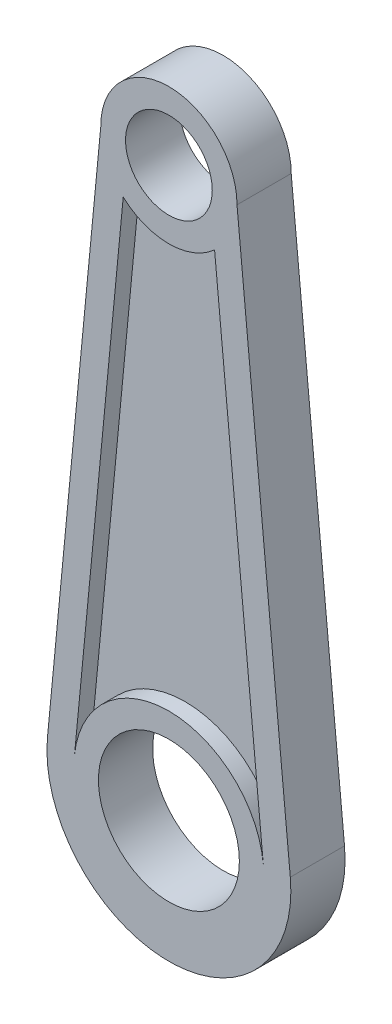
ISO-10303-21;
HEADER;
FILE_DESCRIPTION(('STEP AP214'),'2;1');
FILE_NAME('part.step','',(''),(''),'','','');
FILE_SCHEMA(('AUTOMOTIVE_DESIGN { 1 0 10303 214 1 1 1 1 }'));
ENDSEC;
DATA;
#1=APPLICATION_CONTEXT('core data for automotive mechanical design processes');
#2=APPLICATION_PROTOCOL_DEFINITION('international standard','automotive_design',2000,#1);
#3=PRODUCT_CONTEXT('',#1,'mechanical');
#4=PRODUCT('Part','Part','',(#3));
#5=PRODUCT_RELATED_PRODUCT_CATEGORY('part','',(#4));
#6=PRODUCT_DEFINITION_FORMATION('','',#4);
#7=PRODUCT_DEFINITION_CONTEXT('part definition',#1,'design');
#8=PRODUCT_DEFINITION('design','',#6,#7);
#9=PRODUCT_DEFINITION_SHAPE('','',#8);
#10=(LENGTH_UNIT() NAMED_UNIT(*) SI_UNIT(.MILLI.,.METRE.));
#11=(NAMED_UNIT(*) PLANE_ANGLE_UNIT() SI_UNIT($,.RADIAN.));
#12=(NAMED_UNIT(*) SI_UNIT($,.STERADIAN.) SOLID_ANGLE_UNIT());
#13=UNCERTAINTY_MEASURE_WITH_UNIT(LENGTH_MEASURE(1.E-05),#10,'distance_accuracy_value','');
#14=(GEOMETRIC_REPRESENTATION_CONTEXT(3) GLOBAL_UNCERTAINTY_ASSIGNED_CONTEXT((#13)) GLOBAL_UNIT_ASSIGNED_CONTEXT((#10,
#11,#12)) REPRESENTATION_CONTEXT('',''));
#15=CARTESIAN_POINT('',(0.,0.,0.));
#16=DIRECTION('',(0.,0.,1.));
#17=DIRECTION('',(1.,0.,0.));
#18=AXIS2_PLACEMENT_3D('',#15,#16,#17);
#19=CARTESIAN_POINT('',(-12.4428586323303,105.897439266632,10.));
#20=DIRECTION('',(0.995428690586424,-0.0955077062723116,0.));
#21=DIRECTION('',(0.0955077062723116,0.995428690586424,0.));
#22=AXIS2_PLACEMENT_3D('',#19,#20,#21);
#23=PLANE('',#22);
#24=DIRECTION('',(0.,0.,-1.));
#25=VECTOR('',#24,1.);
#26=CARTESIAN_POINT('',(-12.5624393828669,104.651109367486,10.));
#27=LINE('',#26,#25);
#28=CARTESIAN_POINT('',(-12.5624393828669,104.651109367486,0.));
#29=VERTEX_POINT('',#28);
#30=CARTESIAN_POINT('',(-12.5624393828669,104.651109367486,10.));
#31=VERTEX_POINT('',#30);
#32=EDGE_CURVE('E182',#29,#31,#27,.F.);
#33=ORIENTED_EDGE('',*,*,#32,.F.);
#34=DIRECTION('',(-0.0955077062723116,-0.995428690586424,0.));
#35=VECTOR('',#34,1.);
#36=CARTESIAN_POINT('',(-12.4428586323303,105.897439266632,0.));
#37=LINE('',#36,#35);
#38=CARTESIAN_POINT('',(-22.3971455381945,2.14892339112701,0.));
#39=VERTEX_POINT('',#38);
#40=EDGE_CURVE('E227',#29,#39,#37,.T.);
#41=ORIENTED_EDGE('',*,*,#40,.T.);
#42=DIRECTION('',(0.,0.,-1.));
#43=VECTOR('',#42,1.);
#44=CARTESIAN_POINT('',(-22.3971455381945,2.14892339112701,10.));
#45=LINE('',#44,#43);
#46=CARTESIAN_POINT('',(-22.3971455381945,2.14892339112701,10.));
#47=VERTEX_POINT('',#46);
#48=EDGE_CURVE('E251',#47,#39,#45,.T.);
#49=ORIENTED_EDGE('',*,*,#48,.F.);
#50=DIRECTION('',(-0.0955077062723116,-0.995428690586424,0.));
#51=VECTOR('',#50,1.);
#52=CARTESIAN_POINT('',(-12.4428586323303,105.897439266632,10.));
#53=LINE('',#52,#51);
#54=EDGE_CURVE('E62',#31,#47,#53,.T.);
#55=ORIENTED_EDGE('',*,*,#54,.F.);
#56=EDGE_LOOP('',(#33,#41,#49,#55));
#57=FACE_BOUND('',#56,.T.);
#58=ADVANCED_FACE('F39',(#57),#23,.F.);
#59=CARTESIAN_POINT('',(12.4428586323303,105.897439266632,10.));
#60=DIRECTION('',(-0.995428690586424,-0.0955077062723116,0.));
#61=DIRECTION('',(0.0955077062723116,-0.995428690586424,0.));
#62=AXIS2_PLACEMENT_3D('',#59,#60,#61);
#63=PLANE('',#62);
#64=DIRECTION('',(0.,0.,-1.));
#65=VECTOR('',#64,1.);
#66=CARTESIAN_POINT('',(12.5624393828669,104.651109367486,10.));
#67=LINE('',#66,#65);
#68=CARTESIAN_POINT('',(12.5624393828669,104.651109367486,10.));
#69=VERTEX_POINT('',#68);
#70=CARTESIAN_POINT('',(12.5624393828669,104.651109367486,0.));
#71=VERTEX_POINT('',#70);
#72=EDGE_CURVE('E54',#69,#71,#67,.T.);
#73=ORIENTED_EDGE('',*,*,#72,.F.);
#74=DIRECTION('',(-0.0955077062723116,0.995428690586424,0.));
#75=VECTOR('',#74,1.);
#76=CARTESIAN_POINT('',(12.4428586323303,105.897439266632,10.));
#77=LINE('',#76,#75);
#78=CARTESIAN_POINT('',(22.3971455381945,2.14892339112702,10.));
#79=VERTEX_POINT('',#78);
#80=EDGE_CURVE('E237',#79,#69,#77,.T.);
#81=ORIENTED_EDGE('',*,*,#80,.F.);
#82=DIRECTION('',(0.,0.,-1.));
#83=VECTOR('',#82,1.);
#84=CARTESIAN_POINT('',(22.3971455381945,2.14892339112702,10.));
#85=LINE('',#84,#83);
#86=CARTESIAN_POINT('',(22.3971455381945,2.14892339112702,0.));
#87=VERTEX_POINT('',#86);
#88=EDGE_CURVE('E240',#79,#87,#85,.T.);
#89=ORIENTED_EDGE('',*,*,#88,.T.);
#90=DIRECTION('',(-0.0955077062723116,0.995428690586424,0.));
#91=VECTOR('',#90,1.);
#92=CARTESIAN_POINT('',(12.4428586323303,105.897439266632,0.));
#93=LINE('',#92,#91);
#94=EDGE_CURVE('E234',#87,#71,#93,.T.);
#95=ORIENTED_EDGE('',*,*,#94,.T.);
#96=EDGE_LOOP('',(#73,#81,#89,#95));
#97=FACE_BOUND('',#96,.T.);
#98=ADVANCED_FACE('F278',(#97),#63,.F.);
#99=CARTESIAN_POINT('',(17.4200020852624,1.67138485976546,7.));
#100=DIRECTION('',(0.995428690586424,0.0955077062723117,0.));
#101=DIRECTION('',(-0.0955077062723117,0.995428690586424,0.));
#102=AXIS2_PLACEMENT_3D('',#99,#100,#101);
#103=PLANE('',#102);
#104=DIRECTION('',(0.,0.,-1.));
#105=VECTOR('',#104,1.);
#106=CARTESIAN_POINT('',(8.42824920562205,95.387893656836,10.));
#107=LINE('',#106,#105);
#108=CARTESIAN_POINT('',(8.42824920562205,95.387893656836,7.));
#109=VERTEX_POINT('',#108);
#110=CARTESIAN_POINT('',(8.42824920562205,95.387893656836,10.));
#111=VERTEX_POINT('',#110);
#112=EDGE_CURVE('E176',#109,#111,#107,.F.);
#113=ORIENTED_EDGE('',*,*,#112,.F.);
#114=DIRECTION('',(-0.0955077062723116,0.995428690586424,0.));
#115=VECTOR('',#114,1.);
#116=CARTESIAN_POINT('',(17.4200020852624,1.67138485976546,7.));
#117=LINE('',#116,#115);
#118=CARTESIAN_POINT('',(17.4200020852624,1.67138485976546,7.));
#119=VERTEX_POINT('',#118);
#120=EDGE_CURVE('E213',#119,#109,#117,.T.);
#121=ORIENTED_EDGE('',*,*,#120,.F.);
#122=DIRECTION('',(0.,0.,1.));
#123=VECTOR('',#122,1.);
#124=CARTESIAN_POINT('',(17.4200020852624,1.67138485976546,7.));
#125=LINE('',#124,#123);
#126=CARTESIAN_POINT('',(17.4200020852624,1.67138485976546,10.));
#127=VERTEX_POINT('',#126);
#128=EDGE_CURVE('E223',#119,#127,#125,.T.);
#129=ORIENTED_EDGE('',*,*,#128,.T.);
#130=DIRECTION('',(-0.0955077062723116,0.995428690586424,0.));
#131=VECTOR('',#130,1.);
#132=CARTESIAN_POINT('',(17.4200020852624,1.67138485976546,10.));
#133=LINE('',#132,#131);
#134=EDGE_CURVE('E214',#127,#111,#133,.T.);
#135=ORIENTED_EDGE('',*,*,#134,.T.);
#136=EDGE_LOOP('',(#113,#121,#129,#135));
#137=FACE_BOUND('',#136,.T.);
#138=ADVANCED_FACE('F282',(#137),#103,.F.);
#139=CARTESIAN_POINT('',(-7.46571517939818,105.419900735271,7.));
#140=DIRECTION('',(-0.995428690586424,0.0955077062723116,0.));
#141=DIRECTION('',(-0.0955077062723116,-0.995428690586424,0.));
#142=AXIS2_PLACEMENT_3D('',#139,#140,#141);
#143=PLANE('',#142);
#144=DIRECTION('',(0.,0.,-1.));
#145=VECTOR('',#144,1.);
#146=CARTESIAN_POINT('',(-8.42824920562205,95.387893656836,10.));
#147=LINE('',#146,#145);
#148=CARTESIAN_POINT('',(-8.42824920562205,95.387893656836,10.));
#149=VERTEX_POINT('',#148);
#150=CARTESIAN_POINT('',(-8.42824920562205,95.387893656836,7.));
#151=VERTEX_POINT('',#150);
#152=EDGE_CURVE('E169',#149,#151,#147,.T.);
#153=ORIENTED_EDGE('',*,*,#152,.F.);
#154=DIRECTION('',(-0.0955077062723116,-0.995428690586424,0.));
#155=VECTOR('',#154,1.);
#156=CARTESIAN_POINT('',(-7.46571517939818,105.419900735271,10.));
#157=LINE('',#156,#155);
#158=CARTESIAN_POINT('',(-17.4200020852624,1.67138485976545,10.));
#159=VERTEX_POINT('',#158);
#160=EDGE_CURVE('E207',#149,#159,#157,.T.);
#161=ORIENTED_EDGE('',*,*,#160,.T.);
#162=DIRECTION('',(0.,0.,1.));
#163=VECTOR('',#162,1.);
#164=CARTESIAN_POINT('',(-17.4200020852624,1.67138485976546,7.));
#165=LINE('',#164,#163);
#166=CARTESIAN_POINT('',(-17.4200020852624,1.67138485976545,7.));
#167=VERTEX_POINT('',#166);
#168=EDGE_CURVE('E218',#167,#159,#165,.T.);
#169=ORIENTED_EDGE('',*,*,#168,.F.);
#170=DIRECTION('',(-0.0955077062723116,-0.995428690586424,0.));
#171=VECTOR('',#170,1.);
#172=CARTESIAN_POINT('',(-7.46571517939818,105.419900735271,7.));
#173=LINE('',#172,#171);
#174=EDGE_CURVE('E210',#151,#167,#173,.T.);
#175=ORIENTED_EDGE('',*,*,#174,.F.);
#176=EDGE_LOOP('',(#153,#161,#169,#175));
#177=FACE_BOUND('',#176,.T.);
#178=ADVANCED_FACE('F307',(#177),#143,.F.);
#179=CARTESIAN_POINT('',(-17.4200020852624,1.67138485976546,3.));
#180=DIRECTION('',(-0.995428690586424,0.0955077062723117,0.));
#181=DIRECTION('',(-0.0955077062723117,-0.995428690586424,0.));
#182=AXIS2_PLACEMENT_3D('',#179,#180,#181);
#183=PLANE('',#182);
#184=DIRECTION('',(0.,0.,-1.));
#185=VECTOR('',#184,1.);
#186=CARTESIAN_POINT('',(-8.42824920562205,95.387893656836,10.));
#187=LINE('',#186,#185);
#188=CARTESIAN_POINT('',(-8.42824920562205,95.387893656836,3.));
#189=VERTEX_POINT('',#188);
#190=CARTESIAN_POINT('',(-8.42824920562205,95.387893656836,0.));
#191=VERTEX_POINT('',#190);
#192=EDGE_CURVE('E150',#189,#191,#187,.T.);
#193=ORIENTED_EDGE('',*,*,#192,.F.);
#194=DIRECTION('',(0.0955077062723116,0.995428690586424,0.));
#195=VECTOR('',#194,1.);
#196=CARTESIAN_POINT('',(-17.4200020852624,1.67138485976546,3.));
#197=LINE('',#196,#195);
#198=CARTESIAN_POINT('',(-17.4200020852624,1.67138485976546,3.));
#199=VERTEX_POINT('',#198);
#200=EDGE_CURVE('E196',#199,#189,#197,.T.);
#201=ORIENTED_EDGE('',*,*,#200,.F.);
#202=DIRECTION('',(0.,0.,-1.));
#203=VECTOR('',#202,1.);
#204=CARTESIAN_POINT('',(-17.4200020852624,1.67138485976546,3.));
#205=LINE('',#204,#203);
#206=CARTESIAN_POINT('',(-17.4200020852624,1.67138485976546,0.));
#207=VERTEX_POINT('',#206);
#208=EDGE_CURVE('E203',#199,#207,#205,.T.);
#209=ORIENTED_EDGE('',*,*,#208,.T.);
#210=DIRECTION('',(0.0955077062723116,0.995428690586424,0.));
#211=VECTOR('',#210,1.);
#212=CARTESIAN_POINT('',(-17.4200020852624,1.67138485976546,0.));
#213=LINE('',#212,#211);
#214=EDGE_CURVE('E140',#207,#191,#213,.T.);
#215=ORIENTED_EDGE('',*,*,#214,.T.);
#216=EDGE_LOOP('',(#193,#201,#209,#215));
#217=FACE_BOUND('',#216,.T.);
#218=ADVANCED_FACE('F262',(#217),#183,.F.);
#219=CARTESIAN_POINT('',(7.46571517939818,105.419900735271,3.));
#220=DIRECTION('',(0.995428690586424,0.0955077062723117,0.));
#221=DIRECTION('',(-0.0955077062723117,0.995428690586424,0.));
#222=AXIS2_PLACEMENT_3D('',#219,#220,#221);
#223=PLANE('',#222);
#224=DIRECTION('',(0.,0.,-1.));
#225=VECTOR('',#224,1.);
#226=CARTESIAN_POINT('',(8.42824920562205,95.387893656836,10.));
#227=LINE('',#226,#225);
#228=CARTESIAN_POINT('',(8.42824920562205,95.387893656836,0.));
#229=VERTEX_POINT('',#228);
#230=CARTESIAN_POINT('',(8.42824920562205,95.387893656836,3.));
#231=VERTEX_POINT('',#230);
#232=EDGE_CURVE('E11',#229,#231,#227,.F.);
#233=ORIENTED_EDGE('',*,*,#232,.F.);
#234=DIRECTION('',(0.0955077062723116,-0.995428690586424,0.));
#235=VECTOR('',#234,1.);
#236=CARTESIAN_POINT('',(7.46571517939818,105.419900735271,0.));
#237=LINE('',#236,#235);
#238=CARTESIAN_POINT('',(17.4200020852624,1.67138485976546,0.));
#239=VERTEX_POINT('',#238);
#240=EDGE_CURVE('E129',#229,#239,#237,.T.);
#241=ORIENTED_EDGE('',*,*,#240,.T.);
#242=DIRECTION('',(0.,0.,-1.));
#243=VECTOR('',#242,1.);
#244=CARTESIAN_POINT('',(17.4200020852624,1.67138485976546,3.));
#245=LINE('',#244,#243);
#246=CARTESIAN_POINT('',(17.4200020852624,1.67138485976546,3.));
#247=VERTEX_POINT('',#246);
#248=EDGE_CURVE('E199',#247,#239,#245,.T.);
#249=ORIENTED_EDGE('',*,*,#248,.F.);
#250=DIRECTION('',(0.0955077062723116,-0.995428690586424,0.));
#251=VECTOR('',#250,1.);
#252=CARTESIAN_POINT('',(7.46571517939818,105.419900735271,3.));
#253=LINE('',#252,#251);
#254=EDGE_CURVE('E145',#231,#247,#253,.T.);
#255=ORIENTED_EDGE('',*,*,#254,.F.);
#256=EDGE_LOOP('',(#233,#241,#249,#255));
#257=FACE_BOUND('',#256,.T.);
#258=ADVANCED_FACE('F144',(#257),#223,.F.);
#259=CARTESIAN_POINT('',(0.,104.703592938228,7.));
#260=DIRECTION('',(0.,0.,1.));
#261=DIRECTION('',(1.,0.,0.));
#262=AXIS2_PLACEMENT_3D('',#259,#260,#261);
#263=PLANE('',#262);
#264=ORIENTED_EDGE('',*,*,#120,.T.);
#265=CARTESIAN_POINT('',(0.,104.703592938228,7.));
#266=DIRECTION('',(0.,0.,1.));
#267=DIRECTION('',(1.,0.,0.));
#268=AXIS2_PLACEMENT_3D('',#265,#266,#267);
#269=CIRCLE('',#268,12.5625490157613);
#270=EDGE_CURVE('E173',#109,#151,#269,.F.);
#271=ORIENTED_EDGE('',*,*,#270,.T.);
#272=ORIENTED_EDGE('',*,*,#174,.T.);
#273=CARTESIAN_POINT('',(0.,0.,7.));
#274=DIRECTION('',(0.,0.,1.));
#275=DIRECTION('',(1.,0.,0.));
#276=AXIS2_PLACEMENT_3D('',#273,#274,#275);
#277=CIRCLE('',#276,17.5);
#278=EDGE_CURVE('E141',#167,#119,#277,.F.);
#279=ORIENTED_EDGE('',*,*,#278,.T.);
#280=EDGE_LOOP('',(#264,#271,#272,#279));
#281=FACE_BOUND('',#280,.T.);
#282=ADVANCED_FACE('F305',(#281),#263,.T.);
#283=CARTESIAN_POINT('',(0.,104.703592938228,3.));
#284=DIRECTION('',(0.,0.,-1.));
#285=DIRECTION('',(-1.,0.,0.));
#286=AXIS2_PLACEMENT_3D('',#283,#284,#285);
#287=PLANE('',#286);
#288=ORIENTED_EDGE('',*,*,#200,.T.);
#289=CARTESIAN_POINT('',(0.,104.703592938228,3.));
#290=DIRECTION('',(0.,0.,-1.));
#291=DIRECTION('',(-1.,0.,0.));
#292=AXIS2_PLACEMENT_3D('',#289,#290,#291);
#293=CIRCLE('',#292,12.5625490157613);
#294=EDGE_CURVE('E164',#189,#231,#293,.F.);
#295=ORIENTED_EDGE('',*,*,#294,.T.);
#296=ORIENTED_EDGE('',*,*,#254,.T.);
#297=CARTESIAN_POINT('',(0.,0.,3.));
#298=DIRECTION('',(0.,0.,-1.));
#299=DIRECTION('',(-1.,0.,0.));
#300=AXIS2_PLACEMENT_3D('',#297,#298,#299);
#301=CIRCLE('',#300,17.5);
#302=EDGE_CURVE('E47',#247,#199,#301,.F.);
#303=ORIENTED_EDGE('',*,*,#302,.T.);
#304=EDGE_LOOP('',(#288,#295,#296,#303));
#305=FACE_BOUND('',#304,.T.);
#306=ADVANCED_FACE('F259',(#305),#287,.T.);
#307=CARTESIAN_POINT('',(0.,0.,10.));
#308=DIRECTION('',(0.,0.,-1.));
#309=DIRECTION('',(-1.,0.,0.));
#310=AXIS2_PLACEMENT_3D('',#307,#308,#309);
#311=CYLINDRICAL_SURFACE('',#310,22.5);
#312=CARTESIAN_POINT('',(0.,0.,0.));
#313=DIRECTION('',(0.,0.,1.));
#314=DIRECTION('',(1.,0.,0.));
#315=AXIS2_PLACEMENT_3D('',#312,#313,#314);
#316=CIRCLE('',#315,22.5);
#317=EDGE_CURVE('E243',#39,#87,#316,.T.);
#318=ORIENTED_EDGE('',*,*,#317,.T.);
#319=ORIENTED_EDGE('',*,*,#88,.F.);
#320=CARTESIAN_POINT('',(0.,0.,10.));
#321=DIRECTION('',(0.,0.,1.));
#322=DIRECTION('',(1.,0.,0.));
#323=AXIS2_PLACEMENT_3D('',#320,#321,#322);
#324=CIRCLE('',#323,22.5);
#325=EDGE_CURVE('E233',#47,#79,#324,.T.);
#326=ORIENTED_EDGE('',*,*,#325,.F.);
#327=ORIENTED_EDGE('',*,*,#48,.T.);
#328=EDGE_LOOP('',(#318,#319,#326,#327));
#329=FACE_BOUND('',#328,.T.);
#330=ADVANCED_FACE('F297',(#329),#311,.T.);
#331=CARTESIAN_POINT('',(0.,104.703592938228,10.));
#332=DIRECTION('',(0.,0.,1.));
#333=DIRECTION('',(1.,0.,0.));
#334=AXIS2_PLACEMENT_3D('',#331,#332,#333);
#335=PLANE('',#334);
#336=CARTESIAN_POINT('',(0.,0.,10.));
#337=DIRECTION('',(0.,0.,1.));
#338=DIRECTION('',(1.,0.,0.));
#339=AXIS2_PLACEMENT_3D('',#336,#337,#338);
#340=CIRCLE('',#339,13.);
#341=CARTESIAN_POINT('',(13.,0.,10.));
#342=VERTEX_POINT('',#341);
#343=EDGE_CURVE('E413',#342,#342,#340,.T.);
#344=ORIENTED_EDGE('',*,*,#343,.F.);
#345=EDGE_LOOP('',(#344));
#346=FACE_BOUND('',#345,.T.);
#347=CARTESIAN_POINT('',(0.,104.703592938228,10.));
#348=DIRECTION('',(0.,0.,1.));
#349=DIRECTION('',(1.,0.,0.));
#350=AXIS2_PLACEMENT_3D('',#347,#348,#349);
#351=CIRCLE('',#350,8.);
#352=CARTESIAN_POINT('',(8.,104.703592938228,10.));
#353=VERTEX_POINT('',#352);
#354=EDGE_CURVE('E421',#353,#353,#351,.T.);
#355=ORIENTED_EDGE('',*,*,#354,.F.);
#356=EDGE_LOOP('',(#355));
#357=FACE_BOUND('',#356,.T.);
#358=CARTESIAN_POINT('',(0.,104.703592938228,10.));
#359=DIRECTION('',(0.,0.,1.));
#360=DIRECTION('',(1.,0.,0.));
#361=AXIS2_PLACEMENT_3D('',#358,#359,#360);
#362=CIRCLE('',#361,12.5625490157613);
#363=EDGE_CURVE('E152',#69,#31,#362,.T.);
#364=ORIENTED_EDGE('',*,*,#363,.T.);
#365=ORIENTED_EDGE('',*,*,#54,.T.);
#366=ORIENTED_EDGE('',*,*,#325,.T.);
#367=ORIENTED_EDGE('',*,*,#80,.T.);
#368=EDGE_LOOP('',(#364,#365,#366,#367));
#369=FACE_BOUND('',#368,.T.);
#370=EDGE_CURVE('E158',#149,#111,#362,.T.);
#371=ORIENTED_EDGE('',*,*,#370,.T.);
#372=ORIENTED_EDGE('',*,*,#134,.F.);
#373=CARTESIAN_POINT('',(0.,0.,10.));
#374=DIRECTION('',(0.,0.,1.));
#375=DIRECTION('',(1.,0.,0.));
#376=AXIS2_PLACEMENT_3D('',#373,#374,#375);
#377=CIRCLE('',#376,17.5);
#378=EDGE_CURVE('E185',#127,#159,#377,.T.);
#379=ORIENTED_EDGE('',*,*,#378,.T.);
#380=ORIENTED_EDGE('',*,*,#160,.F.);
#381=EDGE_LOOP('',(#371,#372,#379,#380));
#382=FACE_BOUND('',#381,.T.);
#383=ADVANCED_FACE('F272',(#346,#357,#369,#382),#335,.T.);
#384=CARTESIAN_POINT('',(0.,104.703592938228,0.));
#385=DIRECTION('',(0.,0.,1.));
#386=DIRECTION('',(1.,0.,0.));
#387=AXIS2_PLACEMENT_3D('',#384,#385,#386);
#388=PLANE('',#387);
#389=CARTESIAN_POINT('',(0.,0.,0.));
#390=DIRECTION('',(0.,0.,1.));
#391=DIRECTION('',(1.,0.,0.));
#392=AXIS2_PLACEMENT_3D('',#389,#390,#391);
#393=CIRCLE('',#392,13.);
#394=CARTESIAN_POINT('',(13.,0.,0.));
#395=VERTEX_POINT('',#394);
#396=EDGE_CURVE('E161',#395,#395,#393,.T.);
#397=ORIENTED_EDGE('',*,*,#396,.T.);
#398=EDGE_LOOP('',(#397));
#399=FACE_BOUND('',#398,.T.);
#400=CARTESIAN_POINT('',(0.,104.703592938228,0.));
#401=DIRECTION('',(0.,0.,1.));
#402=DIRECTION('',(1.,0.,0.));
#403=AXIS2_PLACEMENT_3D('',#400,#401,#402);
#404=CIRCLE('',#403,8.);
#405=CARTESIAN_POINT('',(8.,104.703592938228,0.));
#406=VERTEX_POINT('',#405);
#407=EDGE_CURVE('E415',#406,#406,#404,.T.);
#408=ORIENTED_EDGE('',*,*,#407,.T.);
#409=EDGE_LOOP('',(#408));
#410=FACE_BOUND('',#409,.T.);
#411=ORIENTED_EDGE('',*,*,#40,.F.);
#412=CARTESIAN_POINT('',(0.,104.703592938228,0.));
#413=DIRECTION('',(0.,0.,1.));
#414=DIRECTION('',(1.,0.,0.));
#415=AXIS2_PLACEMENT_3D('',#412,#413,#414);
#416=CIRCLE('',#415,12.5625490157613);
#417=EDGE_CURVE('E153',#71,#29,#416,.T.);
#418=ORIENTED_EDGE('',*,*,#417,.F.);
#419=ORIENTED_EDGE('',*,*,#94,.F.);
#420=ORIENTED_EDGE('',*,*,#317,.F.);
#421=EDGE_LOOP('',(#411,#418,#419,#420));
#422=FACE_BOUND('',#421,.T.);
#423=ORIENTED_EDGE('',*,*,#240,.F.);
#424=EDGE_CURVE('E134',#191,#229,#416,.T.);
#425=ORIENTED_EDGE('',*,*,#424,.F.);
#426=ORIENTED_EDGE('',*,*,#214,.F.);
#427=CARTESIAN_POINT('',(0.,0.,0.));
#428=DIRECTION('',(0.,0.,1.));
#429=DIRECTION('',(1.,0.,0.));
#430=AXIS2_PLACEMENT_3D('',#427,#428,#429);
#431=CIRCLE('',#430,17.5);
#432=EDGE_CURVE('E135',#239,#207,#431,.T.);
#433=ORIENTED_EDGE('',*,*,#432,.F.);
#434=EDGE_LOOP('',(#423,#425,#426,#433));
#435=FACE_BOUND('',#434,.T.);
#436=ADVANCED_FACE('F131',(#399,#410,#422,#435),#388,.F.);
#437=CARTESIAN_POINT('',(0.,0.,10.));
#438=DIRECTION('',(0.,0.,-1.));
#439=DIRECTION('',(-1.,0.,0.));
#440=AXIS2_PLACEMENT_3D('',#437,#438,#439);
#441=CYLINDRICAL_SURFACE('',#440,17.5);
#442=ORIENTED_EDGE('',*,*,#432,.T.);
#443=ORIENTED_EDGE('',*,*,#208,.F.);
#444=ORIENTED_EDGE('',*,*,#302,.F.);
#445=ORIENTED_EDGE('',*,*,#248,.T.);
#446=EDGE_LOOP('',(#442,#443,#444,#445));
#447=FACE_BOUND('',#446,.T.);
#448=ADVANCED_FACE('F263',(#447),#441,.T.);
#449=ORIENTED_EDGE('',*,*,#128,.F.);
#450=ORIENTED_EDGE('',*,*,#278,.F.);
#451=ORIENTED_EDGE('',*,*,#168,.T.);
#452=ORIENTED_EDGE('',*,*,#378,.F.);
#453=EDGE_LOOP('',(#449,#450,#451,#452));
#454=FACE_BOUND('',#453,.T.);
#455=ADVANCED_FACE('F265',(#454),#441,.T.);
#456=CARTESIAN_POINT('',(0.,104.703592938228,10.));
#457=DIRECTION('',(0.,0.,-1.));
#458=DIRECTION('',(-1.,0.,0.));
#459=AXIS2_PLACEMENT_3D('',#456,#457,#458);
#460=CYLINDRICAL_SURFACE('',#459,12.5625490157613);
#461=ORIENTED_EDGE('',*,*,#294,.F.);
#462=ORIENTED_EDGE('',*,*,#192,.T.);
#463=ORIENTED_EDGE('',*,*,#424,.T.);
#464=ORIENTED_EDGE('',*,*,#232,.T.);
#465=EDGE_LOOP('',(#461,#462,#463,#464));
#466=FACE_BOUND('',#465,.T.);
#467=ADVANCED_FACE('F149',(#466),#460,.T.);
#468=ORIENTED_EDGE('',*,*,#270,.F.);
#469=ORIENTED_EDGE('',*,*,#112,.T.);
#470=ORIENTED_EDGE('',*,*,#370,.F.);
#471=ORIENTED_EDGE('',*,*,#152,.T.);
#472=EDGE_LOOP('',(#468,#469,#470,#471));
#473=FACE_BOUND('',#472,.T.);
#474=ADVANCED_FACE('F357',(#473),#460,.T.);
#475=ORIENTED_EDGE('',*,*,#417,.T.);
#476=ORIENTED_EDGE('',*,*,#32,.T.);
#477=ORIENTED_EDGE('',*,*,#363,.F.);
#478=ORIENTED_EDGE('',*,*,#72,.T.);
#479=EDGE_LOOP('',(#475,#476,#477,#478));
#480=FACE_BOUND('',#479,.T.);
#481=ADVANCED_FACE('F291',(#480),#460,.T.);
#482=CARTESIAN_POINT('',(0.,104.703592938228,0.));
#483=DIRECTION('',(0.,0.,1.));
#484=DIRECTION('',(1.,0.,0.));
#485=AXIS2_PLACEMENT_3D('',#482,#483,#484);
#486=CYLINDRICAL_SURFACE('',#485,8.);
#487=ORIENTED_EDGE('',*,*,#407,.F.);
#488=EDGE_LOOP('',(#487));
#489=FACE_BOUND('',#488,.T.);
#490=ORIENTED_EDGE('',*,*,#354,.T.);
#491=EDGE_LOOP('',(#490));
#492=FACE_BOUND('',#491,.T.);
#493=ADVANCED_FACE('F373',(#489,#492),#486,.F.);
#494=CARTESIAN_POINT('',(0.,0.,0.));
#495=DIRECTION('',(0.,0.,1.));
#496=DIRECTION('',(1.,0.,0.));
#497=AXIS2_PLACEMENT_3D('',#494,#495,#496);
#498=CYLINDRICAL_SURFACE('',#497,13.);
#499=ORIENTED_EDGE('',*,*,#396,.F.);
#500=EDGE_LOOP('',(#499));
#501=FACE_BOUND('',#500,.T.);
#502=ORIENTED_EDGE('',*,*,#343,.T.);
#503=EDGE_LOOP('',(#502));
#504=FACE_BOUND('',#503,.T.);
#505=ADVANCED_FACE('F394',(#501,#504),#498,.F.);
#506=CLOSED_SHELL('',(#58,#98,#138,#178,#218,#258,#282,#306,#330,#383,#436,#448,#455,#467,#474,
#481,#493,#505));
#507=MANIFOLD_SOLID_BREP('B2',#506);
#508=ADVANCED_BREP_SHAPE_REPRESENTATION('',(#18,#507),#14);
#509=SHAPE_DEFINITION_REPRESENTATION(#9,#508);
ENDSEC;
END-ISO-10303-21;
